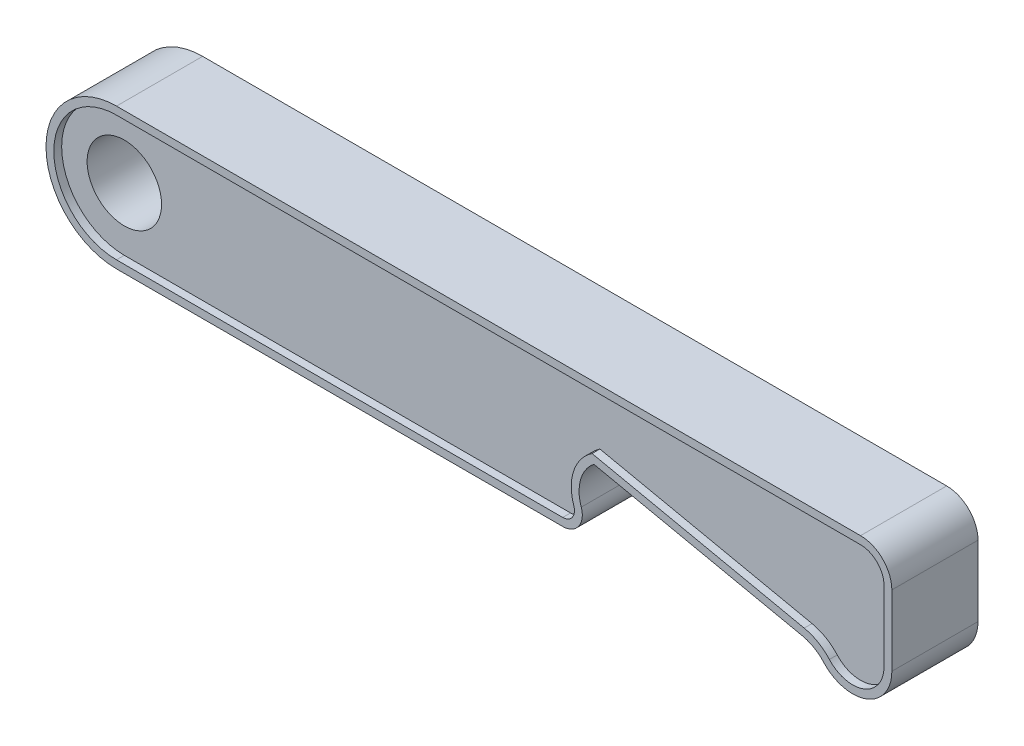
ISO-10303-21;
HEADER;
FILE_DESCRIPTION(('STEP AP214'),'2;1');
FILE_NAME('part.step','',(''),(''),'','','');
FILE_SCHEMA(('AUTOMOTIVE_DESIGN { 1 0 10303 214 1 1 1 1 }'));
ENDSEC;
DATA;
#1=APPLICATION_CONTEXT('core data for automotive mechanical design processes');
#2=APPLICATION_PROTOCOL_DEFINITION('international standard','automotive_design',2000,#1);
#3=PRODUCT_CONTEXT('',#1,'mechanical');
#4=PRODUCT('Part','Part','',(#3));
#5=PRODUCT_RELATED_PRODUCT_CATEGORY('part','',(#4));
#6=PRODUCT_DEFINITION_FORMATION('','',#4);
#7=PRODUCT_DEFINITION_CONTEXT('part definition',#1,'design');
#8=PRODUCT_DEFINITION('design','',#6,#7);
#9=PRODUCT_DEFINITION_SHAPE('','',#8);
#10=(LENGTH_UNIT() NAMED_UNIT(*) SI_UNIT(.MILLI.,.METRE.));
#11=(NAMED_UNIT(*) PLANE_ANGLE_UNIT() SI_UNIT($,.RADIAN.));
#12=(NAMED_UNIT(*) SI_UNIT($,.STERADIAN.) SOLID_ANGLE_UNIT());
#13=UNCERTAINTY_MEASURE_WITH_UNIT(LENGTH_MEASURE(1.E-05),#10,'distance_accuracy_value','');
#14=(GEOMETRIC_REPRESENTATION_CONTEXT(3) GLOBAL_UNCERTAINTY_ASSIGNED_CONTEXT((#13)) GLOBAL_UNIT_ASSIGNED_CONTEXT((#10,
#11,#12)) REPRESENTATION_CONTEXT('',''));
#15=CARTESIAN_POINT('',(0.,0.,0.));
#16=DIRECTION('',(0.,0.,1.));
#17=DIRECTION('',(1.,0.,0.));
#18=AXIS2_PLACEMENT_3D('',#15,#16,#17);
#19=CARTESIAN_POINT('',(56.9788180104058,-6.5,11.));
#20=DIRECTION('',(0.,0.,1.));
#21=DIRECTION('',(1.,0.,0.));
#22=AXIS2_PLACEMENT_3D('',#19,#20,#21);
#23=PLANE('',#22);
#24=CARTESIAN_POINT('',(56.9788180104058,-6.5,11.));
#25=DIRECTION('',(0.,0.,1.));
#26=DIRECTION('',(1.,0.,0.));
#27=AXIS2_PLACEMENT_3D('',#24,#25,#26);
#28=CIRCLE('',#27,2.5);
#29=CARTESIAN_POINT('',(56.9788180104058,-9.,11.));
#30=VERTEX_POINT('',#29);
#31=CARTESIAN_POINT('',(59.3406469259492,-5.68038779065771,11.));
#32=VERTEX_POINT('',#31);
#33=EDGE_CURVE('E202',#30,#32,#28,.T.);
#34=ORIENTED_EDGE('',*,*,#33,.T.);
#35=CARTESIAN_POINT('',(64.0643047570361,-4.04116337197313,11.));
#36=DIRECTION('',(0.,0.,-1.));
#37=DIRECTION('',(-1.,0.,0.));
#38=AXIS2_PLACEMENT_3D('',#35,#36,#37);
#39=CIRCLE('',#38,5.);
#40=CARTESIAN_POINT('',(60.9491136881554,-0.130206378554992,11.));
#41=VERTEX_POINT('',#40);
#42=EDGE_CURVE('E118',#32,#41,#39,.T.);
#43=ORIENTED_EDGE('',*,*,#42,.T.);
#44=DIRECTION('',(0.978147600733805,-0.20791169081776,0.));
#45=VECTOR('',#44,1.);
#46=CARTESIAN_POINT('',(60.9491136881554,-0.130206378554992,11.));
#47=LINE('',#46,#45);
#48=CARTESIAN_POINT('',(87.6038632111249,-5.79584828933305,11.));
#49=VERTEX_POINT('',#48);
#50=EDGE_CURVE('E232',#41,#49,#47,.T.);
#51=ORIENTED_EDGE('',*,*,#50,.T.);
#52=CARTESIAN_POINT('',(86.5643047570361,-10.6865862930021,11.));
#53=DIRECTION('',(0.,0.,-1.));
#54=DIRECTION('',(-1.,0.,0.));
#55=AXIS2_PLACEMENT_3D('',#52,#53,#54);
#56=CIRCLE('',#55,5.);
#57=CARTESIAN_POINT('',(90.282152378518,-7.34329314650104,11.));
#58=VERTEX_POINT('',#57);
#59=EDGE_CURVE('E252',#49,#58,#56,.T.);
#60=ORIENTED_EDGE('',*,*,#59,.T.);
#61=CARTESIAN_POINT('',(94.,-4.,11.));
#62=DIRECTION('',(0.,0.,1.));
#63=DIRECTION('',(1.,0.,0.));
#64=AXIS2_PLACEMENT_3D('',#61,#62,#63);
#65=CIRCLE('',#64,5.);
#66=CARTESIAN_POINT('',(99.,-4.,11.));
#67=VERTEX_POINT('',#66);
#68=EDGE_CURVE('E248',#58,#67,#65,.T.);
#69=ORIENTED_EDGE('',*,*,#68,.T.);
#70=DIRECTION('',(0.,1.,0.));
#71=VECTOR('',#70,1.);
#72=CARTESIAN_POINT('',(99.,-4.,11.));
#73=LINE('',#72,#71);
#74=CARTESIAN_POINT('',(99.,4.99999999999997,11.));
#75=VERTEX_POINT('',#74);
#76=EDGE_CURVE('E251',#67,#75,#73,.T.);
#77=ORIENTED_EDGE('',*,*,#76,.T.);
#78=CARTESIAN_POINT('',(95.,5.,11.));
#79=DIRECTION('',(0.,0.,1.));
#80=DIRECTION('',(-1.,0.,0.));
#81=AXIS2_PLACEMENT_3D('',#78,#79,#80);
#82=CIRCLE('',#81,4.);
#83=CARTESIAN_POINT('',(95.,9.,11.));
#84=VERTEX_POINT('',#83);
#85=EDGE_CURVE('E147',#75,#84,#82,.T.);
#86=ORIENTED_EDGE('',*,*,#85,.T.);
#87=DIRECTION('',(-1.,0.,0.));
#88=VECTOR('',#87,1.);
#89=CARTESIAN_POINT('',(0.,9.,11.));
#90=LINE('',#89,#88);
#91=CARTESIAN_POINT('',(0.,9.,11.));
#92=VERTEX_POINT('',#91);
#93=EDGE_CURVE('E140',#84,#92,#90,.T.);
#94=ORIENTED_EDGE('',*,*,#93,.T.);
#95=CARTESIAN_POINT('',(0.,0.,11.));
#96=DIRECTION('',(0.,0.,1.));
#97=DIRECTION('',(1.,0.,0.));
#98=AXIS2_PLACEMENT_3D('',#95,#96,#97);
#99=CIRCLE('',#98,9.);
#100=CARTESIAN_POINT('',(0.,-9.,11.));
#101=VERTEX_POINT('',#100);
#102=EDGE_CURVE('E144',#92,#101,#99,.T.);
#103=ORIENTED_EDGE('',*,*,#102,.T.);
#104=DIRECTION('',(1.,0.,0.));
#105=VECTOR('',#104,1.);
#106=CARTESIAN_POINT('',(0.,-9.,11.));
#107=LINE('',#106,#105);
#108=EDGE_CURVE('E71',#101,#30,#107,.T.);
#109=ORIENTED_EDGE('',*,*,#108,.T.);
#110=EDGE_LOOP('',(#34,#43,#51,#60,#69,#77,#86,#94,#103,#109));
#111=FACE_BOUND('',#110,.T.);
#112=CARTESIAN_POINT('',(56.9788180104058,-6.5,11.));
#113=DIRECTION('',(0.,0.,1.));
#114=DIRECTION('',(1.,0.,0.));
#115=AXIS2_PLACEMENT_3D('',#112,#113,#114);
#116=CIRCLE('',#115,1.5);
#117=CARTESIAN_POINT('',(56.9788180104058,-8.,11.));
#118=VERTEX_POINT('',#117);
#119=CARTESIAN_POINT('',(58.3959153597318,-6.00823267439462,11.));
#120=VERTEX_POINT('',#119);
#121=EDGE_CURVE('E62',#118,#120,#116,.T.);
#122=ORIENTED_EDGE('',*,*,#121,.F.);
#123=DIRECTION('',(1.,0.,0.));
#124=VECTOR('',#123,1.);
#125=CARTESIAN_POINT('',(0.,-8.,11.));
#126=LINE('',#125,#124);
#127=CARTESIAN_POINT('',(0.,-8.,11.));
#128=VERTEX_POINT('',#127);
#129=EDGE_CURVE('E308',#128,#118,#126,.T.);
#130=ORIENTED_EDGE('',*,*,#129,.F.);
#131=CARTESIAN_POINT('',(0.,0.,11.));
#132=DIRECTION('',(0.,0.,1.));
#133=DIRECTION('',(1.,0.,0.));
#134=AXIS2_PLACEMENT_3D('',#131,#132,#133);
#135=CIRCLE('',#134,8.);
#136=CARTESIAN_POINT('',(0.,8.,11.));
#137=VERTEX_POINT('',#136);
#138=EDGE_CURVE('E313',#137,#128,#135,.T.);
#139=ORIENTED_EDGE('',*,*,#138,.F.);
#140=DIRECTION('',(-1.,0.,0.));
#141=VECTOR('',#140,1.);
#142=CARTESIAN_POINT('',(95.,8.,11.));
#143=LINE('',#142,#141);
#144=CARTESIAN_POINT('',(95.,8.,11.));
#145=VERTEX_POINT('',#144);
#146=EDGE_CURVE('E317',#145,#137,#143,.T.);
#147=ORIENTED_EDGE('',*,*,#146,.F.);
#148=CARTESIAN_POINT('',(95.,5.,11.));
#149=DIRECTION('',(0.,0.,1.));
#150=DIRECTION('',(1.,0.,0.));
#151=AXIS2_PLACEMENT_3D('',#148,#149,#150);
#152=CIRCLE('',#151,3.);
#153=CARTESIAN_POINT('',(98.,4.99999999999997,11.));
#154=VERTEX_POINT('',#153);
#155=EDGE_CURVE('E321',#154,#145,#152,.T.);
#156=ORIENTED_EDGE('',*,*,#155,.F.);
#157=DIRECTION('',(0.,1.,0.));
#158=VECTOR('',#157,1.);
#159=CARTESIAN_POINT('',(98.,-4.,11.));
#160=LINE('',#159,#158);
#161=CARTESIAN_POINT('',(98.,-4.,11.));
#162=VERTEX_POINT('',#161);
#163=EDGE_CURVE('E325',#162,#154,#160,.T.);
#164=ORIENTED_EDGE('',*,*,#163,.F.);
#165=CARTESIAN_POINT('',(94.,-4.,11.));
#166=DIRECTION('',(0.,0.,1.));
#167=DIRECTION('',(1.,0.,0.));
#168=AXIS2_PLACEMENT_3D('',#165,#166,#167);
#169=CIRCLE('',#168,4.);
#170=CARTESIAN_POINT('',(91.0257219028144,-6.67463451720083,11.));
#171=VERTEX_POINT('',#170);
#172=EDGE_CURVE('E329',#171,#162,#169,.T.);
#173=ORIENTED_EDGE('',*,*,#172,.F.);
#174=CARTESIAN_POINT('',(86.5643047570361,-10.6865862930021,11.));
#175=DIRECTION('',(0.,0.,-1.));
#176=DIRECTION('',(1.,0.,0.));
#177=AXIS2_PLACEMENT_3D('',#174,#175,#176);
#178=CIRCLE('',#177,6.);
#179=CARTESIAN_POINT('',(87.8117749019426,-4.81770068859924,11.));
#180=VERTEX_POINT('',#179);
#181=EDGE_CURVE('E333',#180,#171,#178,.T.);
#182=ORIENTED_EDGE('',*,*,#181,.F.);
#183=DIRECTION('',(0.978147600733806,-0.20791169081776,0.));
#184=VECTOR('',#183,1.);
#185=CARTESIAN_POINT('',(60.7205303754729,0.94072109930898,11.));
#186=LINE('',#185,#184);
#187=CARTESIAN_POINT('',(60.7205303754729,0.94072109930898,11.));
#188=VERTEX_POINT('',#187);
#189=EDGE_CURVE('E337',#188,#180,#186,.T.);
#190=ORIENTED_EDGE('',*,*,#189,.F.);
#191=CARTESIAN_POINT('',(64.0643047570361,-4.04116337197313,11.));
#192=DIRECTION('',(0.,0.,-1.));
#193=DIRECTION('',(1.,0.,0.));
#194=AXIS2_PLACEMENT_3D('',#191,#192,#193);
#195=CIRCLE('',#194,6.);
#196=EDGE_CURVE('E341',#120,#188,#195,.T.);
#197=ORIENTED_EDGE('',*,*,#196,.F.);
#198=EDGE_LOOP('',(#122,#130,#139,#147,#156,#164,#173,#182,#190,#197));
#199=FACE_BOUND('',#198,.T.);
#200=ADVANCED_FACE('F45',(#111,#199),#23,.T.);
#201=CARTESIAN_POINT('',(0.,0.,11.));
#202=DIRECTION('',(0.,0.,-1.));
#203=DIRECTION('',(-1.,0.,0.));
#204=AXIS2_PLACEMENT_3D('',#201,#202,#203);
#205=CYLINDRICAL_SURFACE('',#204,4.75);
#206=CARTESIAN_POINT('',(0.,0.,0.));
#207=DIRECTION('',(0.,0.,1.));
#208=DIRECTION('',(1.,0.,0.));
#209=AXIS2_PLACEMENT_3D('',#206,#207,#208);
#210=CIRCLE('',#209,4.75);
#211=CARTESIAN_POINT('',(4.75,0.,0.));
#212=VERTEX_POINT('',#211);
#213=EDGE_CURVE('E177',#212,#212,#210,.T.);
#214=ORIENTED_EDGE('',*,*,#213,.F.);
#215=EDGE_LOOP('',(#214));
#216=FACE_BOUND('',#215,.T.);
#217=CARTESIAN_POINT('',(0.,0.,10.));
#218=DIRECTION('',(0.,0.,1.));
#219=DIRECTION('',(1.,0.,0.));
#220=AXIS2_PLACEMENT_3D('',#217,#218,#219);
#221=CIRCLE('',#220,4.75);
#222=CARTESIAN_POINT('',(4.75,0.,10.));
#223=VERTEX_POINT('',#222);
#224=EDGE_CURVE('E49',#223,#223,#221,.T.);
#225=ORIENTED_EDGE('',*,*,#224,.T.);
#226=EDGE_LOOP('',(#225));
#227=FACE_BOUND('',#226,.T.);
#228=ADVANCED_FACE('F476',(#216,#227),#205,.F.);
#229=CARTESIAN_POINT('',(56.9788180104058,-6.5,0.));
#230=DIRECTION('',(0.,0.,1.));
#231=DIRECTION('',(1.,0.,0.));
#232=AXIS2_PLACEMENT_3D('',#229,#230,#231);
#233=PLANE('',#232);
#234=CARTESIAN_POINT('',(56.9788180104058,-6.5,0.));
#235=DIRECTION('',(0.,0.,1.));
#236=DIRECTION('',(1.,0.,0.));
#237=AXIS2_PLACEMENT_3D('',#234,#235,#236);
#238=CIRCLE('',#237,2.5);
#239=CARTESIAN_POINT('',(56.9788180104058,-9.,0.));
#240=VERTEX_POINT('',#239);
#241=CARTESIAN_POINT('',(59.3406469259492,-5.68038779065771,0.));
#242=VERTEX_POINT('',#241);
#243=EDGE_CURVE('E172',#240,#242,#238,.T.);
#244=ORIENTED_EDGE('',*,*,#243,.F.);
#245=DIRECTION('',(1.,0.,0.));
#246=VECTOR('',#245,1.);
#247=CARTESIAN_POINT('',(0.,-9.,0.));
#248=LINE('',#247,#246);
#249=CARTESIAN_POINT('',(0.,-9.,0.));
#250=VERTEX_POINT('',#249);
#251=EDGE_CURVE('E110',#250,#240,#248,.T.);
#252=ORIENTED_EDGE('',*,*,#251,.F.);
#253=CARTESIAN_POINT('',(0.,0.,0.));
#254=DIRECTION('',(0.,0.,1.));
#255=DIRECTION('',(1.,0.,0.));
#256=AXIS2_PLACEMENT_3D('',#253,#254,#255);
#257=CIRCLE('',#256,9.);
#258=CARTESIAN_POINT('',(0.,9.,0.));
#259=VERTEX_POINT('',#258);
#260=EDGE_CURVE('E197',#259,#250,#257,.T.);
#261=ORIENTED_EDGE('',*,*,#260,.F.);
#262=DIRECTION('',(-1.,0.,0.));
#263=VECTOR('',#262,1.);
#264=CARTESIAN_POINT('',(0.,9.,0.));
#265=LINE('',#264,#263);
#266=CARTESIAN_POINT('',(95.,9.,0.));
#267=VERTEX_POINT('',#266);
#268=EDGE_CURVE('E157',#267,#259,#265,.T.);
#269=ORIENTED_EDGE('',*,*,#268,.F.);
#270=CARTESIAN_POINT('',(95.,5.,0.));
#271=DIRECTION('',(0.,0.,1.));
#272=DIRECTION('',(-1.,0.,0.));
#273=AXIS2_PLACEMENT_3D('',#270,#271,#272);
#274=CIRCLE('',#273,4.);
#275=CARTESIAN_POINT('',(99.,4.99999999999997,0.));
#276=VERTEX_POINT('',#275);
#277=EDGE_CURVE('E192',#276,#267,#274,.T.);
#278=ORIENTED_EDGE('',*,*,#277,.F.);
#279=DIRECTION('',(0.,1.,0.));
#280=VECTOR('',#279,1.);
#281=CARTESIAN_POINT('',(99.,-4.,0.));
#282=LINE('',#281,#280);
#283=CARTESIAN_POINT('',(99.,-4.,0.));
#284=VERTEX_POINT('',#283);
#285=EDGE_CURVE('E189',#284,#276,#282,.T.);
#286=ORIENTED_EDGE('',*,*,#285,.F.);
#287=CARTESIAN_POINT('',(94.,-4.,0.));
#288=DIRECTION('',(0.,0.,1.));
#289=DIRECTION('',(1.,0.,0.));
#290=AXIS2_PLACEMENT_3D('',#287,#288,#289);
#291=CIRCLE('',#290,5.);
#292=CARTESIAN_POINT('',(90.282152378518,-7.34329314650104,0.));
#293=VERTEX_POINT('',#292);
#294=EDGE_CURVE('E186',#293,#284,#291,.T.);
#295=ORIENTED_EDGE('',*,*,#294,.F.);
#296=CARTESIAN_POINT('',(86.5643047570361,-10.6865862930021,0.));
#297=DIRECTION('',(0.,0.,-1.));
#298=DIRECTION('',(-1.,0.,0.));
#299=AXIS2_PLACEMENT_3D('',#296,#297,#298);
#300=CIRCLE('',#299,5.);
#301=CARTESIAN_POINT('',(87.6038632111249,-5.79584828933305,0.));
#302=VERTEX_POINT('',#301);
#303=EDGE_CURVE('E183',#302,#293,#300,.T.);
#304=ORIENTED_EDGE('',*,*,#303,.F.);
#305=DIRECTION('',(0.978147600733805,-0.20791169081776,0.));
#306=VECTOR('',#305,1.);
#307=CARTESIAN_POINT('',(60.9491136881554,-0.130206378554992,0.));
#308=LINE('',#307,#306);
#309=CARTESIAN_POINT('',(60.9491136881554,-0.130206378554992,0.));
#310=VERTEX_POINT('',#309);
#311=EDGE_CURVE('E180',#310,#302,#308,.T.);
#312=ORIENTED_EDGE('',*,*,#311,.F.);
#313=CARTESIAN_POINT('',(64.0643047570361,-4.04116337197313,0.));
#314=DIRECTION('',(0.,0.,-1.));
#315=DIRECTION('',(-1.,0.,0.));
#316=AXIS2_PLACEMENT_3D('',#313,#314,#315);
#317=CIRCLE('',#316,5.);
#318=EDGE_CURVE('E176',#242,#310,#317,.T.);
#319=ORIENTED_EDGE('',*,*,#318,.F.);
#320=EDGE_LOOP('',(#244,#252,#261,#269,#278,#286,#295,#304,#312,#319));
#321=FACE_BOUND('',#320,.T.);
#322=ORIENTED_EDGE('',*,*,#213,.T.);
#323=EDGE_LOOP('',(#322));
#324=FACE_BOUND('',#323,.T.);
#325=ADVANCED_FACE('F236',(#321,#324),#233,.F.);
#326=CARTESIAN_POINT('',(56.9788180104058,-6.5,11.));
#327=DIRECTION('',(0.,0.,-1.));
#328=DIRECTION('',(-1.,0.,0.));
#329=AXIS2_PLACEMENT_3D('',#326,#327,#328);
#330=CYLINDRICAL_SURFACE('',#329,2.5);
#331=ORIENTED_EDGE('',*,*,#243,.T.);
#332=DIRECTION('',(0.,0.,-1.));
#333=VECTOR('',#332,1.);
#334=CARTESIAN_POINT('',(59.3406469259492,-5.68038779065771,11.));
#335=LINE('',#334,#333);
#336=EDGE_CURVE('E11',#32,#242,#335,.T.);
#337=ORIENTED_EDGE('',*,*,#336,.F.);
#338=ORIENTED_EDGE('',*,*,#33,.F.);
#339=DIRECTION('',(0.,0.,-1.));
#340=VECTOR('',#339,1.);
#341=CARTESIAN_POINT('',(56.9788180104058,-9.,11.));
#342=LINE('',#341,#340);
#343=EDGE_CURVE('E168',#30,#240,#342,.T.);
#344=ORIENTED_EDGE('',*,*,#343,.T.);
#345=EDGE_LOOP('',(#331,#337,#338,#344));
#346=FACE_BOUND('',#345,.T.);
#347=ADVANCED_FACE('F47',(#346),#330,.T.);
#348=CARTESIAN_POINT('',(64.0643047570361,-4.04116337197313,11.));
#349=DIRECTION('',(0.,0.,-1.));
#350=DIRECTION('',(-1.,0.,0.));
#351=AXIS2_PLACEMENT_3D('',#348,#349,#350);
#352=CYLINDRICAL_SURFACE('',#351,5.);
#353=ORIENTED_EDGE('',*,*,#318,.T.);
#354=DIRECTION('',(0.,0.,-1.));
#355=VECTOR('',#354,1.);
#356=CARTESIAN_POINT('',(60.9491136881554,-0.130206378554992,11.));
#357=LINE('',#356,#355);
#358=EDGE_CURVE('E55',#41,#310,#357,.T.);
#359=ORIENTED_EDGE('',*,*,#358,.F.);
#360=ORIENTED_EDGE('',*,*,#42,.F.);
#361=ORIENTED_EDGE('',*,*,#336,.T.);
#362=EDGE_LOOP('',(#353,#359,#360,#361));
#363=FACE_BOUND('',#362,.T.);
#364=ADVANCED_FACE('F507',(#363),#352,.F.);
#365=CARTESIAN_POINT('',(60.9491136881554,-0.130206378554992,11.));
#366=DIRECTION('',(0.20791169081776,0.978147600733806,0.));
#367=DIRECTION('',(-0.978147600733806,0.20791169081776,0.));
#368=AXIS2_PLACEMENT_3D('',#365,#366,#367);
#369=PLANE('',#368);
#370=ORIENTED_EDGE('',*,*,#311,.T.);
#371=DIRECTION('',(0.,0.,-1.));
#372=VECTOR('',#371,1.);
#373=CARTESIAN_POINT('',(87.6038632111249,-5.79584828933305,11.));
#374=LINE('',#373,#372);
#375=EDGE_CURVE('E221',#49,#302,#374,.T.);
#376=ORIENTED_EDGE('',*,*,#375,.F.);
#377=ORIENTED_EDGE('',*,*,#50,.F.);
#378=ORIENTED_EDGE('',*,*,#358,.T.);
#379=EDGE_LOOP('',(#370,#376,#377,#378));
#380=FACE_BOUND('',#379,.T.);
#381=ADVANCED_FACE('F230',(#380),#369,.F.);
#382=CARTESIAN_POINT('',(86.5643047570361,-10.6865862930021,11.));
#383=DIRECTION('',(0.,0.,-1.));
#384=DIRECTION('',(-1.,0.,0.));
#385=AXIS2_PLACEMENT_3D('',#382,#383,#384);
#386=CYLINDRICAL_SURFACE('',#385,5.);
#387=ORIENTED_EDGE('',*,*,#303,.T.);
#388=DIRECTION('',(0.,0.,-1.));
#389=VECTOR('',#388,1.);
#390=CARTESIAN_POINT('',(90.282152378518,-7.34329314650104,11.));
#391=LINE('',#390,#389);
#392=EDGE_CURVE('E217',#58,#293,#391,.T.);
#393=ORIENTED_EDGE('',*,*,#392,.F.);
#394=ORIENTED_EDGE('',*,*,#59,.F.);
#395=ORIENTED_EDGE('',*,*,#375,.T.);
#396=EDGE_LOOP('',(#387,#393,#394,#395));
#397=FACE_BOUND('',#396,.T.);
#398=ADVANCED_FACE('F242',(#397),#386,.F.);
#399=CARTESIAN_POINT('',(94.,-4.,11.));
#400=DIRECTION('',(0.,0.,-1.));
#401=DIRECTION('',(-1.,0.,0.));
#402=AXIS2_PLACEMENT_3D('',#399,#400,#401);
#403=CYLINDRICAL_SURFACE('',#402,5.);
#404=ORIENTED_EDGE('',*,*,#294,.T.);
#405=DIRECTION('',(0.,0.,-1.));
#406=VECTOR('',#405,1.);
#407=CARTESIAN_POINT('',(99.,-4.,11.));
#408=LINE('',#407,#406);
#409=EDGE_CURVE('E213',#67,#284,#408,.T.);
#410=ORIENTED_EDGE('',*,*,#409,.F.);
#411=ORIENTED_EDGE('',*,*,#68,.F.);
#412=ORIENTED_EDGE('',*,*,#392,.T.);
#413=EDGE_LOOP('',(#404,#410,#411,#412));
#414=FACE_BOUND('',#413,.T.);
#415=ADVANCED_FACE('F246',(#414),#403,.T.);
#416=CARTESIAN_POINT('',(99.,-4.,11.));
#417=DIRECTION('',(-1.,0.,0.));
#418=DIRECTION('',(0.,0.,1.));
#419=AXIS2_PLACEMENT_3D('',#416,#417,#418);
#420=PLANE('',#419);
#421=ORIENTED_EDGE('',*,*,#285,.T.);
#422=DIRECTION('',(0.,0.,-1.));
#423=VECTOR('',#422,1.);
#424=CARTESIAN_POINT('',(99.,4.99999999999997,11.));
#425=LINE('',#424,#423);
#426=EDGE_CURVE('E209',#75,#276,#425,.T.);
#427=ORIENTED_EDGE('',*,*,#426,.F.);
#428=ORIENTED_EDGE('',*,*,#76,.F.);
#429=ORIENTED_EDGE('',*,*,#409,.T.);
#430=EDGE_LOOP('',(#421,#427,#428,#429));
#431=FACE_BOUND('',#430,.T.);
#432=ADVANCED_FACE('F497',(#431),#420,.F.);
#433=CARTESIAN_POINT('',(95.,5.,11.));
#434=DIRECTION('',(0.,0.,-1.));
#435=DIRECTION('',(-1.,0.,0.));
#436=AXIS2_PLACEMENT_3D('',#433,#434,#435);
#437=CYLINDRICAL_SURFACE('',#436,4.);
#438=ORIENTED_EDGE('',*,*,#277,.T.);
#439=DIRECTION('',(0.,0.,-1.));
#440=VECTOR('',#439,1.);
#441=CARTESIAN_POINT('',(95.,9.,11.));
#442=LINE('',#441,#440);
#443=EDGE_CURVE('E161',#84,#267,#442,.T.);
#444=ORIENTED_EDGE('',*,*,#443,.F.);
#445=ORIENTED_EDGE('',*,*,#85,.F.);
#446=ORIENTED_EDGE('',*,*,#426,.T.);
#447=EDGE_LOOP('',(#438,#444,#445,#446));
#448=FACE_BOUND('',#447,.T.);
#449=ADVANCED_FACE('F494',(#448),#437,.T.);
#450=CARTESIAN_POINT('',(0.,9.,11.));
#451=DIRECTION('',(0.,-1.,0.));
#452=DIRECTION('',(0.,0.,-1.));
#453=AXIS2_PLACEMENT_3D('',#450,#451,#452);
#454=PLANE('',#453);
#455=ORIENTED_EDGE('',*,*,#268,.T.);
#456=DIRECTION('',(0.,0.,-1.));
#457=VECTOR('',#456,1.);
#458=CARTESIAN_POINT('',(0.,9.,11.));
#459=LINE('',#458,#457);
#460=EDGE_CURVE('E154',#92,#259,#459,.T.);
#461=ORIENTED_EDGE('',*,*,#460,.F.);
#462=ORIENTED_EDGE('',*,*,#93,.F.);
#463=ORIENTED_EDGE('',*,*,#443,.T.);
#464=EDGE_LOOP('',(#455,#461,#462,#463));
#465=FACE_BOUND('',#464,.T.);
#466=ADVANCED_FACE('F155',(#465),#454,.F.);
#467=CARTESIAN_POINT('',(0.,0.,11.));
#468=DIRECTION('',(0.,0.,-1.));
#469=DIRECTION('',(-1.,0.,0.));
#470=AXIS2_PLACEMENT_3D('',#467,#468,#469);
#471=CYLINDRICAL_SURFACE('',#470,9.);
#472=ORIENTED_EDGE('',*,*,#260,.T.);
#473=DIRECTION('',(0.,0.,-1.));
#474=VECTOR('',#473,1.);
#475=CARTESIAN_POINT('',(0.,-9.,11.));
#476=LINE('',#475,#474);
#477=EDGE_CURVE('E162',#101,#250,#476,.T.);
#478=ORIENTED_EDGE('',*,*,#477,.F.);
#479=ORIENTED_EDGE('',*,*,#102,.F.);
#480=ORIENTED_EDGE('',*,*,#460,.T.);
#481=EDGE_LOOP('',(#472,#478,#479,#480));
#482=FACE_BOUND('',#481,.T.);
#483=ADVANCED_FACE('F164',(#482),#471,.T.);
#484=CARTESIAN_POINT('',(0.,-9.,11.));
#485=DIRECTION('',(0.,1.,0.));
#486=DIRECTION('',(-1.,0.,0.));
#487=AXIS2_PLACEMENT_3D('',#484,#485,#486);
#488=PLANE('',#487);
#489=ORIENTED_EDGE('',*,*,#251,.T.);
#490=ORIENTED_EDGE('',*,*,#343,.F.);
#491=ORIENTED_EDGE('',*,*,#108,.F.);
#492=ORIENTED_EDGE('',*,*,#477,.T.);
#493=EDGE_LOOP('',(#489,#490,#491,#492));
#494=FACE_BOUND('',#493,.T.);
#495=ADVANCED_FACE('F488',(#494),#488,.F.);
#496=CARTESIAN_POINT('',(56.9788180104058,-6.5,10.));
#497=DIRECTION('',(0.,0.,1.));
#498=DIRECTION('',(1.,0.,0.));
#499=AXIS2_PLACEMENT_3D('',#496,#497,#498);
#500=CYLINDRICAL_SURFACE('',#499,1.5);
#501=ORIENTED_EDGE('',*,*,#121,.T.);
#502=DIRECTION('',(0.,0.,1.));
#503=VECTOR('',#502,1.);
#504=CARTESIAN_POINT('',(58.3959153597318,-6.00823267439462,10.));
#505=LINE('',#504,#503);
#506=CARTESIAN_POINT('',(58.3959153597318,-6.00823267439462,10.));
#507=VERTEX_POINT('',#506);
#508=EDGE_CURVE('E269',#507,#120,#505,.T.);
#509=ORIENTED_EDGE('',*,*,#508,.F.);
#510=CARTESIAN_POINT('',(56.9788180104058,-6.5,10.));
#511=DIRECTION('',(0.,0.,1.));
#512=DIRECTION('',(1.,0.,0.));
#513=AXIS2_PLACEMENT_3D('',#510,#511,#512);
#514=CIRCLE('',#513,1.5);
#515=CARTESIAN_POINT('',(56.9788180104058,-8.,10.));
#516=VERTEX_POINT('',#515);
#517=EDGE_CURVE('E312',#516,#507,#514,.T.);
#518=ORIENTED_EDGE('',*,*,#517,.F.);
#519=DIRECTION('',(0.,0.,1.));
#520=VECTOR('',#519,1.);
#521=CARTESIAN_POINT('',(56.9788180104058,-8.,10.));
#522=LINE('',#521,#520);
#523=EDGE_CURVE('E305',#516,#118,#522,.T.);
#524=ORIENTED_EDGE('',*,*,#523,.T.);
#525=EDGE_LOOP('',(#501,#509,#518,#524));
#526=FACE_BOUND('',#525,.T.);
#527=ADVANCED_FACE('F392',(#526),#500,.F.);
#528=CARTESIAN_POINT('',(0.,-8.,10.));
#529=DIRECTION('',(0.,-1.,0.));
#530=DIRECTION('',(0.,0.,-1.));
#531=AXIS2_PLACEMENT_3D('',#528,#529,#530);
#532=PLANE('',#531);
#533=ORIENTED_EDGE('',*,*,#129,.T.);
#534=ORIENTED_EDGE('',*,*,#523,.F.);
#535=DIRECTION('',(1.,0.,0.));
#536=VECTOR('',#535,1.);
#537=CARTESIAN_POINT('',(0.,-8.,10.));
#538=LINE('',#537,#536);
#539=CARTESIAN_POINT('',(0.,-8.,10.));
#540=VERTEX_POINT('',#539);
#541=EDGE_CURVE('E273',#540,#516,#538,.T.);
#542=ORIENTED_EDGE('',*,*,#541,.F.);
#543=DIRECTION('',(0.,0.,1.));
#544=VECTOR('',#543,1.);
#545=CARTESIAN_POINT('',(0.,-8.,10.));
#546=LINE('',#545,#544);
#547=EDGE_CURVE('E301',#540,#128,#546,.T.);
#548=ORIENTED_EDGE('',*,*,#547,.T.);
#549=EDGE_LOOP('',(#533,#534,#542,#548));
#550=FACE_BOUND('',#549,.T.);
#551=ADVANCED_FACE('F416',(#550),#532,.F.);
#552=CARTESIAN_POINT('',(0.,0.,10.));
#553=DIRECTION('',(0.,0.,1.));
#554=DIRECTION('',(1.,0.,0.));
#555=AXIS2_PLACEMENT_3D('',#552,#553,#554);
#556=CYLINDRICAL_SURFACE('',#555,8.);
#557=ORIENTED_EDGE('',*,*,#138,.T.);
#558=ORIENTED_EDGE('',*,*,#547,.F.);
#559=CARTESIAN_POINT('',(0.,0.,10.));
#560=DIRECTION('',(0.,0.,1.));
#561=DIRECTION('',(1.,0.,0.));
#562=AXIS2_PLACEMENT_3D('',#559,#560,#561);
#563=CIRCLE('',#562,8.);
#564=CARTESIAN_POINT('',(0.,8.,10.));
#565=VERTEX_POINT('',#564);
#566=EDGE_CURVE('E350',#565,#540,#563,.T.);
#567=ORIENTED_EDGE('',*,*,#566,.F.);
#568=DIRECTION('',(0.,0.,1.));
#569=VECTOR('',#568,1.);
#570=CARTESIAN_POINT('',(0.,8.,10.));
#571=LINE('',#570,#569);
#572=EDGE_CURVE('E297',#565,#137,#571,.T.);
#573=ORIENTED_EDGE('',*,*,#572,.T.);
#574=EDGE_LOOP('',(#557,#558,#567,#573));
#575=FACE_BOUND('',#574,.T.);
#576=ADVANCED_FACE('F421',(#575),#556,.F.);
#577=CARTESIAN_POINT('',(95.,8.,10.));
#578=DIRECTION('',(0.,1.,0.));
#579=DIRECTION('',(-1.,0.,0.));
#580=AXIS2_PLACEMENT_3D('',#577,#578,#579);
#581=PLANE('',#580);
#582=ORIENTED_EDGE('',*,*,#146,.T.);
#583=ORIENTED_EDGE('',*,*,#572,.F.);
#584=DIRECTION('',(-1.,0.,0.));
#585=VECTOR('',#584,1.);
#586=CARTESIAN_POINT('',(95.,8.,10.));
#587=LINE('',#586,#585);
#588=CARTESIAN_POINT('',(95.,8.,10.));
#589=VERTEX_POINT('',#588);
#590=EDGE_CURVE('E354',#589,#565,#587,.T.);
#591=ORIENTED_EDGE('',*,*,#590,.F.);
#592=DIRECTION('',(0.,0.,1.));
#593=VECTOR('',#592,1.);
#594=CARTESIAN_POINT('',(95.,8.,10.));
#595=LINE('',#594,#593);
#596=EDGE_CURVE('E293',#589,#145,#595,.T.);
#597=ORIENTED_EDGE('',*,*,#596,.T.);
#598=EDGE_LOOP('',(#582,#583,#591,#597));
#599=FACE_BOUND('',#598,.T.);
#600=ADVANCED_FACE('F452',(#599),#581,.F.);
#601=CARTESIAN_POINT('',(95.,5.,10.));
#602=DIRECTION('',(0.,0.,1.));
#603=DIRECTION('',(1.,0.,0.));
#604=AXIS2_PLACEMENT_3D('',#601,#602,#603);
#605=CYLINDRICAL_SURFACE('',#604,3.);
#606=ORIENTED_EDGE('',*,*,#155,.T.);
#607=ORIENTED_EDGE('',*,*,#596,.F.);
#608=CARTESIAN_POINT('',(95.,5.,10.));
#609=DIRECTION('',(0.,0.,1.));
#610=DIRECTION('',(1.,0.,0.));
#611=AXIS2_PLACEMENT_3D('',#608,#609,#610);
#612=CIRCLE('',#611,3.);
#613=CARTESIAN_POINT('',(98.,4.99999999999997,10.));
#614=VERTEX_POINT('',#613);
#615=EDGE_CURVE('E358',#614,#589,#612,.T.);
#616=ORIENTED_EDGE('',*,*,#615,.F.);
#617=DIRECTION('',(0.,0.,1.));
#618=VECTOR('',#617,1.);
#619=CARTESIAN_POINT('',(98.,4.99999999999997,10.));
#620=LINE('',#619,#618);
#621=EDGE_CURVE('E289',#614,#154,#620,.T.);
#622=ORIENTED_EDGE('',*,*,#621,.T.);
#623=EDGE_LOOP('',(#606,#607,#616,#622));
#624=FACE_BOUND('',#623,.T.);
#625=ADVANCED_FACE('F456',(#624),#605,.F.);
#626=CARTESIAN_POINT('',(98.,-4.,10.));
#627=DIRECTION('',(1.,0.,0.));
#628=DIRECTION('',(0.,0.,-1.));
#629=AXIS2_PLACEMENT_3D('',#626,#627,#628);
#630=PLANE('',#629);
#631=ORIENTED_EDGE('',*,*,#163,.T.);
#632=ORIENTED_EDGE('',*,*,#621,.F.);
#633=DIRECTION('',(0.,1.,0.));
#634=VECTOR('',#633,1.);
#635=CARTESIAN_POINT('',(98.,-4.,10.));
#636=LINE('',#635,#634);
#637=CARTESIAN_POINT('',(98.,-4.,10.));
#638=VERTEX_POINT('',#637);
#639=EDGE_CURVE('E362',#638,#614,#636,.T.);
#640=ORIENTED_EDGE('',*,*,#639,.F.);
#641=DIRECTION('',(0.,0.,1.));
#642=VECTOR('',#641,1.);
#643=CARTESIAN_POINT('',(98.,-4.,10.));
#644=LINE('',#643,#642);
#645=EDGE_CURVE('E285',#638,#162,#644,.T.);
#646=ORIENTED_EDGE('',*,*,#645,.T.);
#647=EDGE_LOOP('',(#631,#632,#640,#646));
#648=FACE_BOUND('',#647,.T.);
#649=ADVANCED_FACE('F461',(#648),#630,.F.);
#650=CARTESIAN_POINT('',(94.,-4.,10.));
#651=DIRECTION('',(0.,0.,1.));
#652=DIRECTION('',(1.,0.,0.));
#653=AXIS2_PLACEMENT_3D('',#650,#651,#652);
#654=CYLINDRICAL_SURFACE('',#653,4.);
#655=ORIENTED_EDGE('',*,*,#172,.T.);
#656=ORIENTED_EDGE('',*,*,#645,.F.);
#657=CARTESIAN_POINT('',(94.,-4.,10.));
#658=DIRECTION('',(0.,0.,1.));
#659=DIRECTION('',(1.,0.,0.));
#660=AXIS2_PLACEMENT_3D('',#657,#658,#659);
#661=CIRCLE('',#660,4.);
#662=CARTESIAN_POINT('',(91.0257219028144,-6.67463451720083,10.));
#663=VERTEX_POINT('',#662);
#664=EDGE_CURVE('E366',#663,#638,#661,.T.);
#665=ORIENTED_EDGE('',*,*,#664,.F.);
#666=DIRECTION('',(0.,0.,1.));
#667=VECTOR('',#666,1.);
#668=CARTESIAN_POINT('',(91.0257219028144,-6.67463451720083,10.));
#669=LINE('',#668,#667);
#670=EDGE_CURVE('E281',#663,#171,#669,.T.);
#671=ORIENTED_EDGE('',*,*,#670,.T.);
#672=EDGE_LOOP('',(#655,#656,#665,#671));
#673=FACE_BOUND('',#672,.T.);
#674=ADVANCED_FACE('F464',(#673),#654,.F.);
#675=CARTESIAN_POINT('',(86.5643047570361,-10.6865862930021,10.));
#676=DIRECTION('',(0.,0.,1.));
#677=DIRECTION('',(1.,0.,0.));
#678=AXIS2_PLACEMENT_3D('',#675,#676,#677);
#679=CYLINDRICAL_SURFACE('',#678,6.);
#680=ORIENTED_EDGE('',*,*,#181,.T.);
#681=ORIENTED_EDGE('',*,*,#670,.F.);
#682=CARTESIAN_POINT('',(86.5643047570361,-10.6865862930021,10.));
#683=DIRECTION('',(0.,0.,-1.));
#684=DIRECTION('',(1.,0.,0.));
#685=AXIS2_PLACEMENT_3D('',#682,#683,#684);
#686=CIRCLE('',#685,6.);
#687=CARTESIAN_POINT('',(87.8117749019426,-4.81770068859924,10.));
#688=VERTEX_POINT('',#687);
#689=EDGE_CURVE('E370',#688,#663,#686,.T.);
#690=ORIENTED_EDGE('',*,*,#689,.F.);
#691=DIRECTION('',(0.,0.,1.));
#692=VECTOR('',#691,1.);
#693=CARTESIAN_POINT('',(87.8117749019426,-4.81770068859924,10.));
#694=LINE('',#693,#692);
#695=EDGE_CURVE('E277',#688,#180,#694,.T.);
#696=ORIENTED_EDGE('',*,*,#695,.T.);
#697=EDGE_LOOP('',(#680,#681,#690,#696));
#698=FACE_BOUND('',#697,.T.);
#699=ADVANCED_FACE('F466',(#698),#679,.T.);
#700=CARTESIAN_POINT('',(60.7205303754729,0.94072109930898,10.));
#701=DIRECTION('',(-0.20791169081776,-0.978147600733806,0.));
#702=DIRECTION('',(0.978147600733806,-0.20791169081776,0.));
#703=AXIS2_PLACEMENT_3D('',#700,#701,#702);
#704=PLANE('',#703);
#705=ORIENTED_EDGE('',*,*,#189,.T.);
#706=ORIENTED_EDGE('',*,*,#695,.F.);
#707=DIRECTION('',(0.978147600733806,-0.20791169081776,0.));
#708=VECTOR('',#707,1.);
#709=CARTESIAN_POINT('',(60.7205303754729,0.94072109930898,10.));
#710=LINE('',#709,#708);
#711=CARTESIAN_POINT('',(60.7205303754729,0.94072109930898,10.));
#712=VERTEX_POINT('',#711);
#713=EDGE_CURVE('E374',#712,#688,#710,.T.);
#714=ORIENTED_EDGE('',*,*,#713,.F.);
#715=DIRECTION('',(0.,0.,1.));
#716=VECTOR('',#715,1.);
#717=CARTESIAN_POINT('',(60.7205303754729,0.94072109930898,10.));
#718=LINE('',#717,#716);
#719=EDGE_CURVE('E272',#712,#188,#718,.T.);
#720=ORIENTED_EDGE('',*,*,#719,.T.);
#721=EDGE_LOOP('',(#705,#706,#714,#720));
#722=FACE_BOUND('',#721,.T.);
#723=ADVANCED_FACE('F435',(#722),#704,.F.);
#724=CARTESIAN_POINT('',(64.0643047570361,-4.04116337197313,10.));
#725=DIRECTION('',(0.,0.,1.));
#726=DIRECTION('',(1.,0.,0.));
#727=AXIS2_PLACEMENT_3D('',#724,#725,#726);
#728=CYLINDRICAL_SURFACE('',#727,6.);
#729=ORIENTED_EDGE('',*,*,#196,.T.);
#730=ORIENTED_EDGE('',*,*,#719,.F.);
#731=CARTESIAN_POINT('',(64.0643047570361,-4.04116337197313,10.));
#732=DIRECTION('',(0.,0.,-1.));
#733=DIRECTION('',(1.,0.,0.));
#734=AXIS2_PLACEMENT_3D('',#731,#732,#733);
#735=CIRCLE('',#734,6.);
#736=EDGE_CURVE('E378',#507,#712,#735,.T.);
#737=ORIENTED_EDGE('',*,*,#736,.F.);
#738=ORIENTED_EDGE('',*,*,#508,.T.);
#739=EDGE_LOOP('',(#729,#730,#737,#738));
#740=FACE_BOUND('',#739,.T.);
#741=ADVANCED_FACE('F429',(#740),#728,.T.);
#742=CARTESIAN_POINT('',(56.9788180104058,-6.5,10.));
#743=DIRECTION('',(0.,0.,1.));
#744=DIRECTION('',(1.,0.,0.));
#745=AXIS2_PLACEMENT_3D('',#742,#743,#744);
#746=PLANE('',#745);
#747=ORIENTED_EDGE('',*,*,#224,.F.);
#748=EDGE_LOOP('',(#747));
#749=FACE_BOUND('',#748,.T.);
#750=ORIENTED_EDGE('',*,*,#517,.T.);
#751=ORIENTED_EDGE('',*,*,#736,.T.);
#752=ORIENTED_EDGE('',*,*,#713,.T.);
#753=ORIENTED_EDGE('',*,*,#689,.T.);
#754=ORIENTED_EDGE('',*,*,#664,.T.);
#755=ORIENTED_EDGE('',*,*,#639,.T.);
#756=ORIENTED_EDGE('',*,*,#615,.T.);
#757=ORIENTED_EDGE('',*,*,#590,.T.);
#758=ORIENTED_EDGE('',*,*,#566,.T.);
#759=ORIENTED_EDGE('',*,*,#541,.T.);
#760=EDGE_LOOP('',(#750,#751,#752,#753,#754,#755,#756,#757,#758,#759));
#761=FACE_BOUND('',#760,.T.);
#762=ADVANCED_FACE('F387',(#749,#761),#746,.T.);
#763=CLOSED_SHELL('',(#200,#228,#325,#347,#364,#381,#398,#415,#432,#449,#466,#483,#495,#527,
#551,#576,#600,#625,#649,#674,#699,#723,#741,#762));
#764=MANIFOLD_SOLID_BREP('B2',#763);
#765=ADVANCED_BREP_SHAPE_REPRESENTATION('',(#18,#764),#14);
#766=SHAPE_DEFINITION_REPRESENTATION(#9,#765);
ENDSEC;
END-ISO-10303-21;
